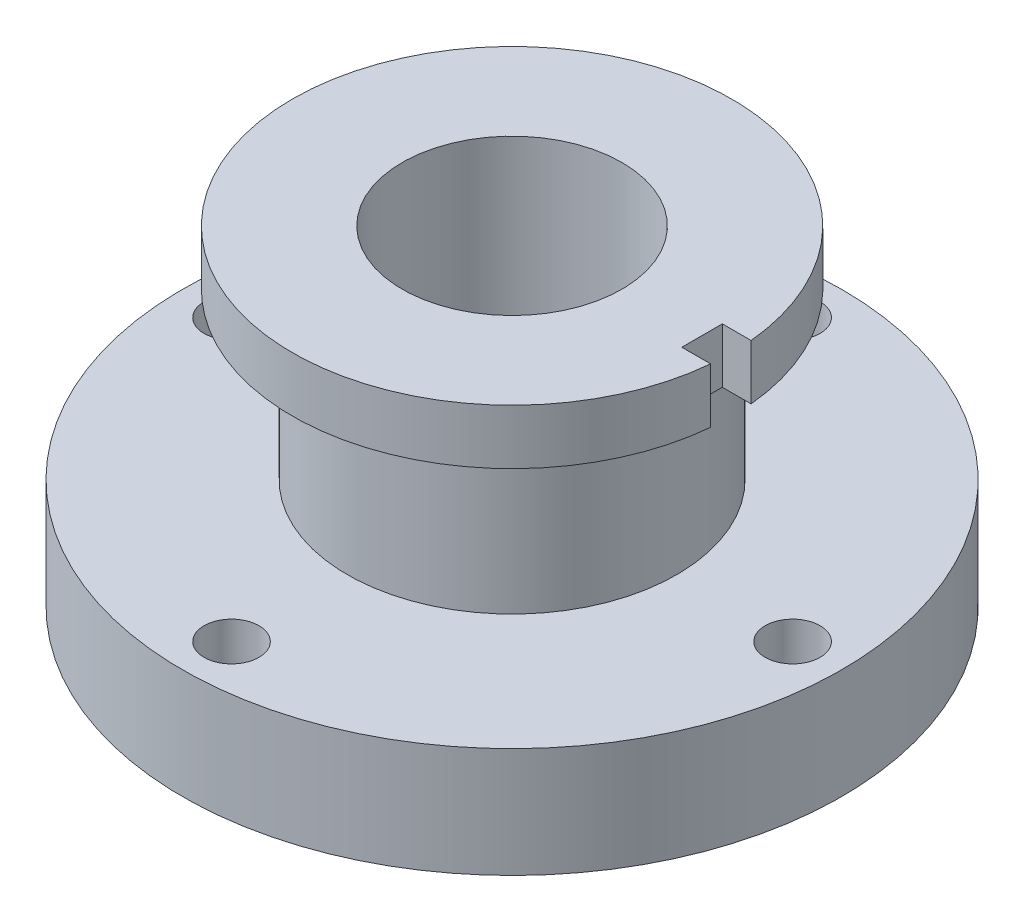
ISO-10303-21;
HEADER;
FILE_DESCRIPTION(('STEP AP214'),'2;1');
FILE_NAME('part.step','',(''),(''),'','','');
FILE_SCHEMA(('AUTOMOTIVE_DESIGN { 1 0 10303 214 1 1 1 1 }'));
ENDSEC;
DATA;
#1=APPLICATION_CONTEXT('core data for automotive mechanical design processes');
#2=APPLICATION_PROTOCOL_DEFINITION('international standard','automotive_design',2000,#1);
#3=PRODUCT_CONTEXT('',#1,'mechanical');
#4=PRODUCT('Part','Part','',(#3));
#5=PRODUCT_RELATED_PRODUCT_CATEGORY('part','',(#4));
#6=PRODUCT_DEFINITION_FORMATION('','',#4);
#7=PRODUCT_DEFINITION_CONTEXT('part definition',#1,'design');
#8=PRODUCT_DEFINITION('design','',#6,#7);
#9=PRODUCT_DEFINITION_SHAPE('','',#8);
#10=(LENGTH_UNIT() NAMED_UNIT(*) SI_UNIT(.MILLI.,.METRE.));
#11=(NAMED_UNIT(*) PLANE_ANGLE_UNIT() SI_UNIT($,.RADIAN.));
#12=(NAMED_UNIT(*) SI_UNIT($,.STERADIAN.) SOLID_ANGLE_UNIT());
#13=UNCERTAINTY_MEASURE_WITH_UNIT(LENGTH_MEASURE(1.E-05),#10,'distance_accuracy_value','');
#14=(GEOMETRIC_REPRESENTATION_CONTEXT(3) GLOBAL_UNCERTAINTY_ASSIGNED_CONTEXT((#13)) GLOBAL_UNIT_ASSIGNED_CONTEXT((#10,
#11,#12)) REPRESENTATION_CONTEXT('',''));
#15=CARTESIAN_POINT('',(0.,0.,0.));
#16=DIRECTION('',(0.,0.,1.));
#17=DIRECTION('',(1.,0.,0.));
#18=AXIS2_PLACEMENT_3D('',#15,#16,#17);
#19=CARTESIAN_POINT('',(0.,-251.612903225806,0.));
#20=DIRECTION('',(0.,-1.,0.));
#21=DIRECTION('',(0.,0.,-1.));
#22=AXIS2_PLACEMENT_3D('',#19,#20,#21);
#23=PLANE('',#22);
#24=CARTESIAN_POINT('',(0.,-251.612903225806,-255.365455534732));
#25=DIRECTION('',(0.,1.,0.));
#26=DIRECTION('',(0.,0.,1.));
#27=AXIS2_PLACEMENT_3D('',#24,#25,#26);
#28=CIRCLE('',#27,25.);
#29=CARTESIAN_POINT('',(0.,-251.612903225806,-230.365455534732));
#30=VERTEX_POINT('',#29);
#31=EDGE_CURVE('E105',#30,#30,#28,.T.);
#32=ORIENTED_EDGE('',*,*,#31,.T.);
#33=EDGE_LOOP('',(#32));
#34=FACE_BOUND('',#33,.T.);
#35=CARTESIAN_POINT('',(255.365455534739,-251.612903225806,-7.21101290261088E-12));
#36=DIRECTION('',(0.,1.,0.));
#37=DIRECTION('',(0.,0.,1.));
#38=AXIS2_PLACEMENT_3D('',#35,#36,#37);
#39=CIRCLE('',#38,25.0000000000057);
#40=CARTESIAN_POINT('',(255.365455534739,-251.612903225806,24.9999999999984));
#41=VERTEX_POINT('',#40);
#42=EDGE_CURVE('E112',#41,#41,#39,.T.);
#43=ORIENTED_EDGE('',*,*,#42,.T.);
#44=EDGE_LOOP('',(#43));
#45=FACE_BOUND('',#44,.T.);
#46=CARTESIAN_POINT('',(1.44220258052218E-11,-251.612903225806,255.365455534732));
#47=DIRECTION('',(0.,1.,0.));
#48=DIRECTION('',(0.,0.,1.));
#49=AXIS2_PLACEMENT_3D('',#46,#47,#48);
#50=CIRCLE('',#49,25.0000000000155);
#51=CARTESIAN_POINT('',(1.44220258052218E-11,-251.612903225806,280.365455534747));
#52=VERTEX_POINT('',#51);
#53=EDGE_CURVE('E118',#52,#52,#50,.T.);
#54=ORIENTED_EDGE('',*,*,#53,.T.);
#55=EDGE_LOOP('',(#54));
#56=FACE_BOUND('',#55,.T.);
#57=CARTESIAN_POINT('',(-255.365455534724,-251.612903225806,7.24228615138422E-12));
#58=DIRECTION('',(0.,1.,0.));
#59=DIRECTION('',(0.,0.,1.));
#60=AXIS2_PLACEMENT_3D('',#57,#58,#59);
#61=CIRCLE('',#60,25.0000000000116);
#62=CARTESIAN_POINT('',(-255.365455534724,-251.612903225806,25.0000000000188));
#63=VERTEX_POINT('',#62);
#64=EDGE_CURVE('E124',#63,#63,#61,.T.);
#65=ORIENTED_EDGE('',*,*,#64,.T.);
#66=EDGE_LOOP('',(#65));
#67=FACE_BOUND('',#66,.T.);
#68=CARTESIAN_POINT('',(0.,-251.612903225806,0.));
#69=DIRECTION('',(0.,-1.,0.));
#70=DIRECTION('',(0.,0.,-1.));
#71=AXIS2_PLACEMENT_3D('',#68,#69,#70);
#72=CIRCLE('',#71,300.);
#73=CARTESIAN_POINT('',(0.,-251.612903225806,-300.));
#74=VERTEX_POINT('',#73);
#75=EDGE_CURVE('E42',#74,#74,#72,.T.);
#76=ORIENTED_EDGE('',*,*,#75,.T.);
#77=EDGE_LOOP('',(#76));
#78=FACE_BOUND('',#77,.T.);
#79=ADVANCED_FACE('F35',(#34,#45,#56,#67,#78),#23,.T.);
#80=CARTESIAN_POINT('',(0.,-251.612903225806,0.));
#81=DIRECTION('',(0.,-1.,0.));
#82=DIRECTION('',(0.,0.,-1.));
#83=AXIS2_PLACEMENT_3D('',#80,#81,#82);
#84=CYLINDRICAL_SURFACE('',#83,300.);
#85=CARTESIAN_POINT('',(0.,-151.612903225806,0.));
#86=DIRECTION('',(0.,-1.,0.));
#87=DIRECTION('',(0.,0.,-1.));
#88=AXIS2_PLACEMENT_3D('',#85,#86,#87);
#89=CIRCLE('',#88,300.);
#90=CARTESIAN_POINT('',(0.,-151.612903225806,-300.));
#91=VERTEX_POINT('',#90);
#92=EDGE_CURVE('E145',#91,#91,#89,.T.);
#93=ORIENTED_EDGE('',*,*,#92,.T.);
#94=EDGE_LOOP('',(#93));
#95=FACE_BOUND('',#94,.T.);
#96=ORIENTED_EDGE('',*,*,#75,.F.);
#97=EDGE_LOOP('',(#96));
#98=FACE_BOUND('',#97,.T.);
#99=ADVANCED_FACE('F151',(#95,#98),#84,.T.);
#100=CARTESIAN_POINT('',(300.,-151.612903225806,0.));
#101=DIRECTION('',(0.,1.,0.));
#102=DIRECTION('',(0.,0.,1.));
#103=AXIS2_PLACEMENT_3D('',#100,#101,#102);
#104=PLANE('',#103);
#105=CARTESIAN_POINT('',(0.,-151.612903225806,-255.365455534732));
#106=DIRECTION('',(0.,1.,0.));
#107=DIRECTION('',(0.,0.,1.));
#108=AXIS2_PLACEMENT_3D('',#105,#106,#107);
#109=CIRCLE('',#108,25.);
#110=CARTESIAN_POINT('',(0.,-151.612903225806,-230.365455534732));
#111=VERTEX_POINT('',#110);
#112=EDGE_CURVE('E109',#111,#111,#109,.T.);
#113=ORIENTED_EDGE('',*,*,#112,.F.);
#114=EDGE_LOOP('',(#113));
#115=FACE_BOUND('',#114,.T.);
#116=CARTESIAN_POINT('',(255.365455534739,-151.612903225806,-7.21101290261088E-12));
#117=DIRECTION('',(0.,1.,0.));
#118=DIRECTION('',(0.,0.,1.));
#119=AXIS2_PLACEMENT_3D('',#116,#117,#118);
#120=CIRCLE('',#119,25.0000000000057);
#121=CARTESIAN_POINT('',(255.365455534739,-151.612903225806,24.9999999999984));
#122=VERTEX_POINT('',#121);
#123=EDGE_CURVE('E115',#122,#122,#120,.T.);
#124=ORIENTED_EDGE('',*,*,#123,.F.);
#125=EDGE_LOOP('',(#124));
#126=FACE_BOUND('',#125,.T.);
#127=CARTESIAN_POINT('',(1.44220258052218E-11,-151.612903225806,255.365455534732));
#128=DIRECTION('',(0.,1.,0.));
#129=DIRECTION('',(0.,0.,1.));
#130=AXIS2_PLACEMENT_3D('',#127,#128,#129);
#131=CIRCLE('',#130,25.0000000000155);
#132=CARTESIAN_POINT('',(1.44220258052218E-11,-151.612903225806,280.365455534747));
#133=VERTEX_POINT('',#132);
#134=EDGE_CURVE('E121',#133,#133,#131,.T.);
#135=ORIENTED_EDGE('',*,*,#134,.F.);
#136=EDGE_LOOP('',(#135));
#137=FACE_BOUND('',#136,.T.);
#138=CARTESIAN_POINT('',(-255.365455534724,-151.612903225806,7.24228615138422E-12));
#139=DIRECTION('',(0.,1.,0.));
#140=DIRECTION('',(0.,0.,1.));
#141=AXIS2_PLACEMENT_3D('',#138,#139,#140);
#142=CIRCLE('',#141,25.0000000000116);
#143=CARTESIAN_POINT('',(-255.365455534724,-151.612903225806,25.0000000000188));
#144=VERTEX_POINT('',#143);
#145=EDGE_CURVE('E104',#144,#144,#142,.T.);
#146=ORIENTED_EDGE('',*,*,#145,.F.);
#147=EDGE_LOOP('',(#146));
#148=FACE_BOUND('',#147,.T.);
#149=CARTESIAN_POINT('',(0.,-151.612903225806,0.));
#150=DIRECTION('',(0.,-1.,0.));
#151=DIRECTION('',(0.,0.,-1.));
#152=AXIS2_PLACEMENT_3D('',#149,#150,#151);
#153=CIRCLE('',#152,150.);
#154=CARTESIAN_POINT('',(0.,-151.612903225806,-150.));
#155=VERTEX_POINT('',#154);
#156=EDGE_CURVE('E142',#155,#155,#153,.T.);
#157=ORIENTED_EDGE('',*,*,#156,.T.);
#158=EDGE_LOOP('',(#157));
#159=FACE_BOUND('',#158,.T.);
#160=ORIENTED_EDGE('',*,*,#92,.F.);
#161=EDGE_LOOP('',(#160));
#162=FACE_BOUND('',#161,.T.);
#163=ADVANCED_FACE('F153',(#115,#126,#137,#148,#159,#162),#104,.T.);
#164=CARTESIAN_POINT('',(0.,-251.612903225806,0.));
#165=DIRECTION('',(0.,-1.,0.));
#166=DIRECTION('',(0.,0.,-1.));
#167=AXIS2_PLACEMENT_3D('',#164,#165,#166);
#168=CYLINDRICAL_SURFACE('',#167,150.);
#169=CARTESIAN_POINT('',(0.,-1.61290322580646,0.));
#170=DIRECTION('',(0.,-1.,0.));
#171=DIRECTION('',(0.,0.,-1.));
#172=AXIS2_PLACEMENT_3D('',#169,#170,#171);
#173=CIRCLE('',#172,150.);
#174=CARTESIAN_POINT('',(0.,-1.61290322580646,-150.));
#175=VERTEX_POINT('',#174);
#176=EDGE_CURVE('E139',#175,#175,#173,.T.);
#177=ORIENTED_EDGE('',*,*,#176,.T.);
#178=EDGE_LOOP('',(#177));
#179=FACE_BOUND('',#178,.T.);
#180=ORIENTED_EDGE('',*,*,#156,.F.);
#181=EDGE_LOOP('',(#180));
#182=FACE_BOUND('',#181,.T.);
#183=ADVANCED_FACE('F159',(#179,#182),#168,.T.);
#184=CARTESIAN_POINT('',(150.,-1.61290322580646,0.));
#185=DIRECTION('',(0.,-1.,0.));
#186=DIRECTION('',(0.,0.,-1.));
#187=AXIS2_PLACEMENT_3D('',#184,#185,#186);
#188=PLANE('',#187);
#189=DIRECTION('',(-1.,0.,0.));
#190=VECTOR('',#189,1.);
#191=CARTESIAN_POINT('',(150.,-1.61290322580646,18.4455656558198));
#192=LINE('',#191,#190);
#193=CARTESIAN_POINT('',(199.147586246072,-1.61290322580646,18.4455656558198));
#194=VERTEX_POINT('',#193);
#195=CARTESIAN_POINT('',(172.943870379538,-1.61290322580646,18.4455656558198));
#196=VERTEX_POINT('',#195);
#197=EDGE_CURVE('E102',#194,#196,#192,.T.);
#198=ORIENTED_EDGE('',*,*,#197,.F.);
#199=CARTESIAN_POINT('',(0.,-1.61290322580646,0.));
#200=DIRECTION('',(0.,-1.,0.));
#201=DIRECTION('',(0.,0.,-1.));
#202=AXIS2_PLACEMENT_3D('',#199,#200,#201);
#203=CIRCLE('',#202,200.);
#204=CARTESIAN_POINT('',(199.147586246072,-1.61290322580646,-18.4455656558198));
#205=VERTEX_POINT('',#204);
#206=EDGE_CURVE('E136',#194,#205,#203,.T.);
#207=ORIENTED_EDGE('',*,*,#206,.T.);
#208=DIRECTION('',(1.,0.,0.));
#209=VECTOR('',#208,1.);
#210=CARTESIAN_POINT('',(150.,-1.61290322580646,-18.4455656558198));
#211=LINE('',#210,#209);
#212=CARTESIAN_POINT('',(172.943870379538,-1.61290322580646,-18.4455656558198));
#213=VERTEX_POINT('',#212);
#214=EDGE_CURVE('E98',#213,#205,#211,.T.);
#215=ORIENTED_EDGE('',*,*,#214,.F.);
#216=DIRECTION('',(0.,0.,-1.));
#217=VECTOR('',#216,1.);
#218=CARTESIAN_POINT('',(172.943870379538,-1.61290322580646,0.));
#219=LINE('',#218,#217);
#220=EDGE_CURVE('E82',#196,#213,#219,.T.);
#221=ORIENTED_EDGE('',*,*,#220,.F.);
#222=EDGE_LOOP('',(#198,#207,#215,#221));
#223=FACE_BOUND('',#222,.T.);
#224=ORIENTED_EDGE('',*,*,#176,.F.);
#225=EDGE_LOOP('',(#224));
#226=FACE_BOUND('',#225,.T.);
#227=ADVANCED_FACE('F166',(#223,#226),#188,.T.);
#228=CARTESIAN_POINT('',(0.,-251.612903225806,0.));
#229=DIRECTION('',(0.,-1.,0.));
#230=DIRECTION('',(0.,0.,-1.));
#231=AXIS2_PLACEMENT_3D('',#228,#229,#230);
#232=CYLINDRICAL_SURFACE('',#231,200.);
#233=DIRECTION('',(0.,-1.,0.));
#234=VECTOR('',#233,1.);
#235=CARTESIAN_POINT('',(199.147586246072,-251.612903225806,18.4455656558198));
#236=LINE('',#235,#234);
#237=CARTESIAN_POINT('',(199.147586246072,48.3870967741935,18.4455656558198));
#238=VERTEX_POINT('',#237);
#239=EDGE_CURVE('E56',#238,#194,#236,.T.);
#240=ORIENTED_EDGE('',*,*,#239,.F.);
#241=CARTESIAN_POINT('',(0.,48.3870967741936,0.));
#242=DIRECTION('',(0.,-1.,0.));
#243=DIRECTION('',(0.,0.,-1.));
#244=AXIS2_PLACEMENT_3D('',#241,#242,#243);
#245=CIRCLE('',#244,200.);
#246=CARTESIAN_POINT('',(199.147586246072,48.3870967741936,-18.4455656558198));
#247=VERTEX_POINT('',#246);
#248=EDGE_CURVE('E134',#238,#247,#245,.T.);
#249=ORIENTED_EDGE('',*,*,#248,.T.);
#250=DIRECTION('',(0.,-1.,0.));
#251=VECTOR('',#250,1.);
#252=CARTESIAN_POINT('',(199.147586246072,-251.612903225806,-18.4455656558198));
#253=LINE('',#252,#251);
#254=EDGE_CURVE('E48',#205,#247,#253,.F.);
#255=ORIENTED_EDGE('',*,*,#254,.F.);
#256=ORIENTED_EDGE('',*,*,#206,.F.);
#257=EDGE_LOOP('',(#240,#249,#255,#256));
#258=FACE_BOUND('',#257,.T.);
#259=ADVANCED_FACE('F170',(#258),#232,.T.);
#260=CARTESIAN_POINT('',(152.822580645162,48.3870967741935,0.));
#261=DIRECTION('',(0.,1.,0.));
#262=DIRECTION('',(0.,0.,1.));
#263=AXIS2_PLACEMENT_3D('',#260,#261,#262);
#264=PLANE('',#263);
#265=DIRECTION('',(1.,0.,0.));
#266=VECTOR('',#265,1.);
#267=CARTESIAN_POINT('',(172.943870379538,48.3870967741935,18.4455656558198));
#268=LINE('',#267,#266);
#269=CARTESIAN_POINT('',(172.943870379538,48.3870967741935,18.4455656558198));
#270=VERTEX_POINT('',#269);
#271=EDGE_CURVE('E85',#270,#238,#268,.T.);
#272=ORIENTED_EDGE('',*,*,#271,.F.);
#273=DIRECTION('',(0.,0.,1.));
#274=VECTOR('',#273,1.);
#275=CARTESIAN_POINT('',(172.943870379538,48.3870967741935,-18.4455656558198));
#276=LINE('',#275,#274);
#277=CARTESIAN_POINT('',(172.943870379538,48.3870967741935,-18.4455656558198));
#278=VERTEX_POINT('',#277);
#279=EDGE_CURVE('E79',#278,#270,#276,.T.);
#280=ORIENTED_EDGE('',*,*,#279,.F.);
#281=DIRECTION('',(-1.,0.,0.));
#282=VECTOR('',#281,1.);
#283=CARTESIAN_POINT('',(152.822580645162,48.3870967741935,-18.4455656558198));
#284=LINE('',#283,#282);
#285=EDGE_CURVE('E11',#247,#278,#284,.T.);
#286=ORIENTED_EDGE('',*,*,#285,.F.);
#287=ORIENTED_EDGE('',*,*,#248,.F.);
#288=EDGE_LOOP('',(#272,#280,#286,#287));
#289=FACE_BOUND('',#288,.T.);
#290=CARTESIAN_POINT('',(0.,48.3870967741935,0.));
#291=DIRECTION('',(0.,-1.,0.));
#292=DIRECTION('',(0.,0.,-1.));
#293=AXIS2_PLACEMENT_3D('',#290,#291,#292);
#294=CIRCLE('',#293,100.);
#295=CARTESIAN_POINT('',(0.,48.3870967741935,-100.));
#296=VERTEX_POINT('',#295);
#297=EDGE_CURVE('E131',#296,#296,#294,.T.);
#298=ORIENTED_EDGE('',*,*,#297,.T.);
#299=EDGE_LOOP('',(#298));
#300=FACE_BOUND('',#299,.T.);
#301=ADVANCED_FACE('F91',(#289,#300),#264,.T.);
#302=CARTESIAN_POINT('',(0.,-251.612903225806,0.));
#303=DIRECTION('',(0.,-1.,0.));
#304=DIRECTION('',(0.,0.,-1.));
#305=AXIS2_PLACEMENT_3D('',#302,#303,#304);
#306=CYLINDRICAL_SURFACE('',#305,100.);
#307=CARTESIAN_POINT('',(0.,-151.612903225806,0.));
#308=DIRECTION('',(0.,-1.,0.));
#309=DIRECTION('',(0.,0.,-1.));
#310=AXIS2_PLACEMENT_3D('',#307,#308,#309);
#311=CIRCLE('',#310,100.);
#312=CARTESIAN_POINT('',(0.,-151.612903225806,-100.));
#313=VERTEX_POINT('',#312);
#314=EDGE_CURVE('E108',#313,#313,#311,.T.);
#315=ORIENTED_EDGE('',*,*,#314,.T.);
#316=EDGE_LOOP('',(#315));
#317=FACE_BOUND('',#316,.T.);
#318=ORIENTED_EDGE('',*,*,#297,.F.);
#319=EDGE_LOOP('',(#318));
#320=FACE_BOUND('',#319,.T.);
#321=ADVANCED_FACE('F177',(#317,#320),#306,.F.);
#322=CARTESIAN_POINT('',(100.,-151.612903225806,0.));
#323=DIRECTION('',(0.,1.,0.));
#324=DIRECTION('',(0.,0.,1.));
#325=AXIS2_PLACEMENT_3D('',#322,#323,#324);
#326=PLANE('',#325);
#327=ORIENTED_EDGE('',*,*,#314,.F.);
#328=EDGE_LOOP('',(#327));
#329=FACE_BOUND('',#328,.T.);
#330=ADVANCED_FACE('F180',(#329),#326,.T.);
#331=CARTESIAN_POINT('',(-255.365455534724,-251.612903225806,7.24228615138422E-12));
#332=DIRECTION('',(0.,1.,0.));
#333=DIRECTION('',(0.,0.,1.));
#334=AXIS2_PLACEMENT_3D('',#331,#332,#333);
#335=CYLINDRICAL_SURFACE('',#334,25.0000000000116);
#336=ORIENTED_EDGE('',*,*,#64,.F.);
#337=EDGE_LOOP('',(#336));
#338=FACE_BOUND('',#337,.T.);
#339=ORIENTED_EDGE('',*,*,#145,.T.);
#340=EDGE_LOOP('',(#339));
#341=FACE_BOUND('',#340,.T.);
#342=ADVANCED_FACE('F184',(#338,#341),#335,.F.);
#343=CARTESIAN_POINT('',(1.44220258052218E-11,-251.612903225806,255.365455534732));
#344=DIRECTION('',(0.,1.,0.));
#345=DIRECTION('',(0.,0.,1.));
#346=AXIS2_PLACEMENT_3D('',#343,#344,#345);
#347=CYLINDRICAL_SURFACE('',#346,25.0000000000155);
#348=ORIENTED_EDGE('',*,*,#53,.F.);
#349=EDGE_LOOP('',(#348));
#350=FACE_BOUND('',#349,.T.);
#351=ORIENTED_EDGE('',*,*,#134,.T.);
#352=EDGE_LOOP('',(#351));
#353=FACE_BOUND('',#352,.T.);
#354=ADVANCED_FACE('F188',(#350,#353),#347,.F.);
#355=CARTESIAN_POINT('',(255.365455534739,-251.612903225806,-7.21101290261088E-12));
#356=DIRECTION('',(0.,1.,0.));
#357=DIRECTION('',(0.,0.,1.));
#358=AXIS2_PLACEMENT_3D('',#355,#356,#357);
#359=CYLINDRICAL_SURFACE('',#358,25.0000000000057);
#360=ORIENTED_EDGE('',*,*,#42,.F.);
#361=EDGE_LOOP('',(#360));
#362=FACE_BOUND('',#361,.T.);
#363=ORIENTED_EDGE('',*,*,#123,.T.);
#364=EDGE_LOOP('',(#363));
#365=FACE_BOUND('',#364,.T.);
#366=ADVANCED_FACE('F192',(#362,#365),#359,.F.);
#367=CARTESIAN_POINT('',(0.,-251.612903225806,-255.365455534732));
#368=DIRECTION('',(0.,1.,0.));
#369=DIRECTION('',(0.,0.,1.));
#370=AXIS2_PLACEMENT_3D('',#367,#368,#369);
#371=CYLINDRICAL_SURFACE('',#370,25.);
#372=ORIENTED_EDGE('',*,*,#31,.F.);
#373=EDGE_LOOP('',(#372));
#374=FACE_BOUND('',#373,.T.);
#375=ORIENTED_EDGE('',*,*,#112,.T.);
#376=EDGE_LOOP('',(#375));
#377=FACE_BOUND('',#376,.T.);
#378=ADVANCED_FACE('F196',(#374,#377),#371,.F.);
#379=CARTESIAN_POINT('',(172.943870379538,-26.6129032258065,18.4455656558198));
#380=DIRECTION('',(0.,0.,1.));
#381=DIRECTION('',(1.,0.,0.));
#382=AXIS2_PLACEMENT_3D('',#379,#380,#381);
#383=PLANE('',#382);
#384=ORIENTED_EDGE('',*,*,#197,.T.);
#385=DIRECTION('',(0.,1.,0.));
#386=VECTOR('',#385,1.);
#387=CARTESIAN_POINT('',(172.943870379538,-26.6129032258065,18.4455656558198));
#388=LINE('',#387,#386);
#389=EDGE_CURVE('E84',#196,#270,#388,.T.);
#390=ORIENTED_EDGE('',*,*,#389,.T.);
#391=ORIENTED_EDGE('',*,*,#271,.T.);
#392=ORIENTED_EDGE('',*,*,#239,.T.);
#393=EDGE_LOOP('',(#384,#390,#391,#392));
#394=FACE_BOUND('',#393,.T.);
#395=ADVANCED_FACE('F200',(#394),#383,.F.);
#396=CARTESIAN_POINT('',(172.943870379538,-26.6129032258065,-18.4455656558198));
#397=DIRECTION('',(-1.,0.,0.));
#398=DIRECTION('',(0.,0.,1.));
#399=AXIS2_PLACEMENT_3D('',#396,#397,#398);
#400=PLANE('',#399);
#401=ORIENTED_EDGE('',*,*,#220,.T.);
#402=DIRECTION('',(0.,1.,0.));
#403=VECTOR('',#402,1.);
#404=CARTESIAN_POINT('',(172.943870379538,-26.6129032258065,-18.4455656558198));
#405=LINE('',#404,#403);
#406=EDGE_CURVE('E75',#213,#278,#405,.T.);
#407=ORIENTED_EDGE('',*,*,#406,.T.);
#408=ORIENTED_EDGE('',*,*,#279,.T.);
#409=ORIENTED_EDGE('',*,*,#389,.F.);
#410=EDGE_LOOP('',(#401,#407,#408,#409));
#411=FACE_BOUND('',#410,.T.);
#412=ADVANCED_FACE('F76',(#411),#400,.F.);
#413=CARTESIAN_POINT('',(172.943870379538,-26.6129032258065,-18.4455656558198));
#414=DIRECTION('',(0.,0.,-1.));
#415=DIRECTION('',(-1.,0.,0.));
#416=AXIS2_PLACEMENT_3D('',#413,#414,#415);
#417=PLANE('',#416);
#418=ORIENTED_EDGE('',*,*,#214,.T.);
#419=ORIENTED_EDGE('',*,*,#254,.T.);
#420=ORIENTED_EDGE('',*,*,#285,.T.);
#421=ORIENTED_EDGE('',*,*,#406,.F.);
#422=EDGE_LOOP('',(#418,#419,#420,#421));
#423=FACE_BOUND('',#422,.T.);
#424=ADVANCED_FACE('F87',(#423),#417,.F.);
#425=CLOSED_SHELL('',(#79,#99,#163,#183,#227,#259,#301,#321,#330,#342,#354,#366,#378,#395,#412,#424));
#426=MANIFOLD_SOLID_BREP('B2',#425);
#427=ADVANCED_BREP_SHAPE_REPRESENTATION('',(#18,#426),#14);
#428=SHAPE_DEFINITION_REPRESENTATION(#9,#427);
ENDSEC;
END-ISO-10303-21;
